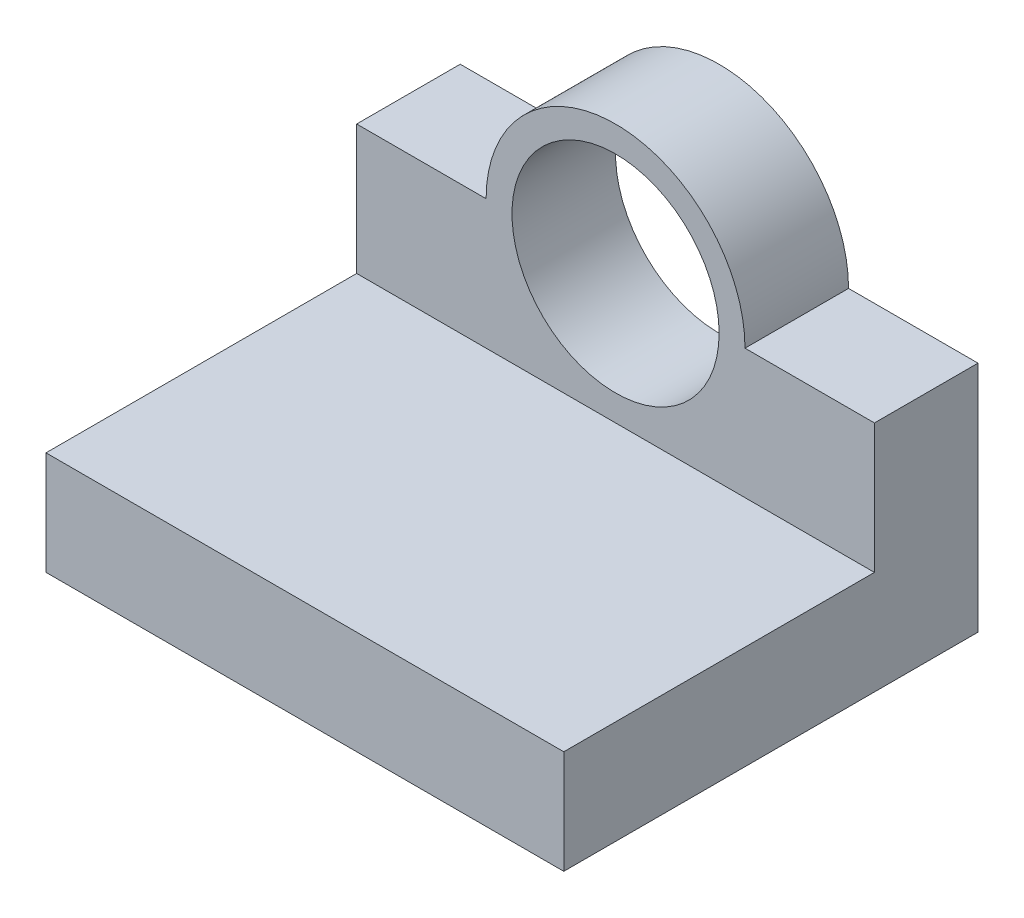
ISO-10303-21;
HEADER;
FILE_DESCRIPTION(('STEP AP214'),'2;1');
FILE_NAME('part.step','',(''),(''),'','','');
FILE_SCHEMA(('AUTOMOTIVE_DESIGN { 1 0 10303 214 1 1 1 1 }'));
ENDSEC;
DATA;
#1=APPLICATION_CONTEXT('core data for automotive mechanical design processes');
#2=APPLICATION_PROTOCOL_DEFINITION('international standard','automotive_design',2000,#1);
#3=PRODUCT_CONTEXT('',#1,'mechanical');
#4=PRODUCT('Part','Part','',(#3));
#5=PRODUCT_RELATED_PRODUCT_CATEGORY('part','',(#4));
#6=PRODUCT_DEFINITION_FORMATION('','',#4);
#7=PRODUCT_DEFINITION_CONTEXT('part definition',#1,'design');
#8=PRODUCT_DEFINITION('design','',#6,#7);
#9=PRODUCT_DEFINITION_SHAPE('','',#8);
#10=(LENGTH_UNIT() NAMED_UNIT(*) SI_UNIT(.MILLI.,.METRE.));
#11=(NAMED_UNIT(*) PLANE_ANGLE_UNIT() SI_UNIT($,.RADIAN.));
#12=(NAMED_UNIT(*) SI_UNIT($,.STERADIAN.) SOLID_ANGLE_UNIT());
#13=UNCERTAINTY_MEASURE_WITH_UNIT(LENGTH_MEASURE(1.E-05),#10,'distance_accuracy_value','');
#14=(GEOMETRIC_REPRESENTATION_CONTEXT(3) GLOBAL_UNCERTAINTY_ASSIGNED_CONTEXT((#13)) GLOBAL_UNIT_ASSIGNED_CONTEXT((#10,
#11,#12)) REPRESENTATION_CONTEXT('',''));
#15=CARTESIAN_POINT('',(0.,0.,0.));
#16=DIRECTION('',(0.,0.,1.));
#17=DIRECTION('',(1.,0.,0.));
#18=AXIS2_PLACEMENT_3D('',#15,#16,#17);
#19=CARTESIAN_POINT('',(0.,22.5,20.));
#20=DIRECTION('',(0.,0.,1.));
#21=DIRECTION('',(1.,0.,0.));
#22=AXIS2_PLACEMENT_3D('',#19,#20,#21);
#23=PLANE('',#22);
#24=DIRECTION('',(-1.,0.,0.));
#25=VECTOR('',#24,1.);
#26=CARTESIAN_POINT('',(-50.,-2.5,20.));
#27=LINE('',#26,#25);
#28=CARTESIAN_POINT('',(50.,-2.49999999999999,20.));
#29=VERTEX_POINT('',#28);
#30=CARTESIAN_POINT('',(-50.,-2.5,20.));
#31=VERTEX_POINT('',#30);
#32=EDGE_CURVE('E54',#29,#31,#27,.T.);
#33=ORIENTED_EDGE('',*,*,#32,.F.);
#34=DIRECTION('',(0.,1.,0.));
#35=VECTOR('',#34,1.);
#36=CARTESIAN_POINT('',(50.,22.5,20.));
#37=LINE('',#36,#35);
#38=CARTESIAN_POINT('',(50.,22.5,20.));
#39=VERTEX_POINT('',#38);
#40=EDGE_CURVE('E93',#29,#39,#37,.T.);
#41=ORIENTED_EDGE('',*,*,#40,.T.);
#42=DIRECTION('',(-1.,0.,0.));
#43=VECTOR('',#42,1.);
#44=CARTESIAN_POINT('',(25.,22.5,20.));
#45=LINE('',#44,#43);
#46=CARTESIAN_POINT('',(25.,22.5,20.));
#47=VERTEX_POINT('',#46);
#48=EDGE_CURVE('E144',#39,#47,#45,.T.);
#49=ORIENTED_EDGE('',*,*,#48,.T.);
#50=CARTESIAN_POINT('',(0.,22.5,20.));
#51=DIRECTION('',(0.,0.,1.));
#52=DIRECTION('',(1.,0.,0.));
#53=AXIS2_PLACEMENT_3D('',#50,#51,#52);
#54=CIRCLE('',#53,25.);
#55=CARTESIAN_POINT('',(-25.,22.5,20.));
#56=VERTEX_POINT('',#55);
#57=EDGE_CURVE('E146',#47,#56,#54,.T.);
#58=ORIENTED_EDGE('',*,*,#57,.T.);
#59=DIRECTION('',(-1.,0.,0.));
#60=VECTOR('',#59,1.);
#61=CARTESIAN_POINT('',(-50.,22.5,20.));
#62=LINE('',#61,#60);
#63=CARTESIAN_POINT('',(-50.,22.5,20.));
#64=VERTEX_POINT('',#63);
#65=EDGE_CURVE('E61',#56,#64,#62,.T.);
#66=ORIENTED_EDGE('',*,*,#65,.T.);
#67=DIRECTION('',(0.,-1.,0.));
#68=VECTOR('',#67,1.);
#69=CARTESIAN_POINT('',(-50.,22.5,20.));
#70=LINE('',#69,#68);
#71=EDGE_CURVE('E149',#64,#31,#70,.T.);
#72=ORIENTED_EDGE('',*,*,#71,.T.);
#73=EDGE_LOOP('',(#33,#41,#49,#58,#66,#72));
#74=FACE_BOUND('',#73,.T.);
#75=CARTESIAN_POINT('',(0.,22.5,20.));
#76=DIRECTION('',(0.,0.,1.));
#77=DIRECTION('',(1.,0.,0.));
#78=AXIS2_PLACEMENT_3D('',#75,#76,#77);
#79=CIRCLE('',#78,20.);
#80=CARTESIAN_POINT('',(20.,22.5,20.));
#81=VERTEX_POINT('',#80);
#82=EDGE_CURVE('E135',#81,#81,#79,.T.);
#83=ORIENTED_EDGE('',*,*,#82,.F.);
#84=EDGE_LOOP('',(#83));
#85=FACE_BOUND('',#84,.T.);
#86=ADVANCED_FACE('F39',(#74,#85),#23,.T.);
#87=CARTESIAN_POINT('',(0.,22.5,0.));
#88=DIRECTION('',(0.,0.,1.));
#89=DIRECTION('',(1.,0.,0.));
#90=AXIS2_PLACEMENT_3D('',#87,#88,#89);
#91=PLANE('',#90);
#92=DIRECTION('',(0.,1.,0.));
#93=VECTOR('',#92,1.);
#94=CARTESIAN_POINT('',(50.,22.5,0.));
#95=LINE('',#94,#93);
#96=CARTESIAN_POINT('',(50.,-22.5,0.));
#97=VERTEX_POINT('',#96);
#98=CARTESIAN_POINT('',(50.,22.5,0.));
#99=VERTEX_POINT('',#98);
#100=EDGE_CURVE('E141',#97,#99,#95,.T.);
#101=ORIENTED_EDGE('',*,*,#100,.F.);
#102=DIRECTION('',(1.,0.,0.));
#103=VECTOR('',#102,1.);
#104=CARTESIAN_POINT('',(-50.,-22.5,0.));
#105=LINE('',#104,#103);
#106=CARTESIAN_POINT('',(-50.,-22.5,0.));
#107=VERTEX_POINT('',#106);
#108=EDGE_CURVE('E89',#107,#97,#105,.T.);
#109=ORIENTED_EDGE('',*,*,#108,.F.);
#110=DIRECTION('',(0.,-1.,0.));
#111=VECTOR('',#110,1.);
#112=CARTESIAN_POINT('',(-50.,22.5,0.));
#113=LINE('',#112,#111);
#114=CARTESIAN_POINT('',(-50.,22.5,0.));
#115=VERTEX_POINT('',#114);
#116=EDGE_CURVE('E159',#115,#107,#113,.T.);
#117=ORIENTED_EDGE('',*,*,#116,.F.);
#118=DIRECTION('',(-1.,0.,0.));
#119=VECTOR('',#118,1.);
#120=CARTESIAN_POINT('',(-50.,22.5,0.));
#121=LINE('',#120,#119);
#122=CARTESIAN_POINT('',(-25.,22.5,0.));
#123=VERTEX_POINT('',#122);
#124=EDGE_CURVE('E157',#123,#115,#121,.T.);
#125=ORIENTED_EDGE('',*,*,#124,.F.);
#126=CARTESIAN_POINT('',(0.,22.5,0.));
#127=DIRECTION('',(0.,0.,1.));
#128=DIRECTION('',(1.,0.,0.));
#129=AXIS2_PLACEMENT_3D('',#126,#127,#128);
#130=CIRCLE('',#129,25.);
#131=CARTESIAN_POINT('',(25.,22.5,0.));
#132=VERTEX_POINT('',#131);
#133=EDGE_CURVE('E155',#132,#123,#130,.T.);
#134=ORIENTED_EDGE('',*,*,#133,.F.);
#135=DIRECTION('',(-1.,0.,0.));
#136=VECTOR('',#135,1.);
#137=CARTESIAN_POINT('',(25.,22.5,0.));
#138=LINE('',#137,#136);
#139=EDGE_CURVE('E153',#99,#132,#138,.T.);
#140=ORIENTED_EDGE('',*,*,#139,.F.);
#141=EDGE_LOOP('',(#101,#109,#117,#125,#134,#140));
#142=FACE_BOUND('',#141,.T.);
#143=CARTESIAN_POINT('',(0.,22.5,0.));
#144=DIRECTION('',(0.,0.,1.));
#145=DIRECTION('',(1.,0.,0.));
#146=AXIS2_PLACEMENT_3D('',#143,#144,#145);
#147=CIRCLE('',#146,20.);
#148=CARTESIAN_POINT('',(20.,22.5,0.));
#149=VERTEX_POINT('',#148);
#150=EDGE_CURVE('E132',#149,#149,#147,.T.);
#151=ORIENTED_EDGE('',*,*,#150,.T.);
#152=EDGE_LOOP('',(#151));
#153=FACE_BOUND('',#152,.T.);
#154=ADVANCED_FACE('F181',(#142,#153),#91,.F.);
#155=CARTESIAN_POINT('',(50.,22.5,20.));
#156=DIRECTION('',(-1.,0.,0.));
#157=DIRECTION('',(0.,0.,1.));
#158=AXIS2_PLACEMENT_3D('',#155,#156,#157);
#159=PLANE('',#158);
#160=ORIENTED_EDGE('',*,*,#100,.T.);
#161=DIRECTION('',(0.,0.,-1.));
#162=VECTOR('',#161,1.);
#163=CARTESIAN_POINT('',(50.,22.5,20.));
#164=LINE('',#163,#162);
#165=EDGE_CURVE('E11',#39,#99,#164,.T.);
#166=ORIENTED_EDGE('',*,*,#165,.F.);
#167=ORIENTED_EDGE('',*,*,#40,.F.);
#168=DIRECTION('',(0.,0.,-1.));
#169=VECTOR('',#168,1.);
#170=CARTESIAN_POINT('',(50.,-2.5,80.));
#171=LINE('',#170,#169);
#172=CARTESIAN_POINT('',(50.,-2.5,80.));
#173=VERTEX_POINT('',#172);
#174=EDGE_CURVE('E114',#173,#29,#171,.T.);
#175=ORIENTED_EDGE('',*,*,#174,.F.);
#176=DIRECTION('',(0.,1.,0.));
#177=VECTOR('',#176,1.);
#178=CARTESIAN_POINT('',(50.,-2.5,80.));
#179=LINE('',#178,#177);
#180=CARTESIAN_POINT('',(50.,-22.5,80.));
#181=VERTEX_POINT('',#180);
#182=EDGE_CURVE('E121',#181,#173,#179,.T.);
#183=ORIENTED_EDGE('',*,*,#182,.F.);
#184=DIRECTION('',(0.,0.,-1.));
#185=VECTOR('',#184,1.);
#186=CARTESIAN_POINT('',(50.,-22.5,20.));
#187=LINE('',#186,#185);
#188=EDGE_CURVE('E151',#181,#97,#187,.T.);
#189=ORIENTED_EDGE('',*,*,#188,.T.);
#190=EDGE_LOOP('',(#160,#166,#167,#175,#183,#189));
#191=FACE_BOUND('',#190,.T.);
#192=ADVANCED_FACE('F41',(#191),#159,.F.);
#193=CARTESIAN_POINT('',(25.,22.5,20.));
#194=DIRECTION('',(0.,-1.,0.));
#195=DIRECTION('',(0.,0.,-1.));
#196=AXIS2_PLACEMENT_3D('',#193,#194,#195);
#197=PLANE('',#196);
#198=ORIENTED_EDGE('',*,*,#139,.T.);
#199=DIRECTION('',(0.,0.,-1.));
#200=VECTOR('',#199,1.);
#201=CARTESIAN_POINT('',(25.,22.5,20.));
#202=LINE('',#201,#200);
#203=EDGE_CURVE('E47',#47,#132,#202,.T.);
#204=ORIENTED_EDGE('',*,*,#203,.F.);
#205=ORIENTED_EDGE('',*,*,#48,.F.);
#206=ORIENTED_EDGE('',*,*,#165,.T.);
#207=EDGE_LOOP('',(#198,#204,#205,#206));
#208=FACE_BOUND('',#207,.T.);
#209=ADVANCED_FACE('F193',(#208),#197,.F.);
#210=CARTESIAN_POINT('',(0.,22.5,20.));
#211=DIRECTION('',(0.,0.,-1.));
#212=DIRECTION('',(-1.,0.,0.));
#213=AXIS2_PLACEMENT_3D('',#210,#211,#212);
#214=CYLINDRICAL_SURFACE('',#213,25.);
#215=ORIENTED_EDGE('',*,*,#133,.T.);
#216=DIRECTION('',(0.,0.,-1.));
#217=VECTOR('',#216,1.);
#218=CARTESIAN_POINT('',(-25.,22.5,20.));
#219=LINE('',#218,#217);
#220=EDGE_CURVE('E168',#56,#123,#219,.T.);
#221=ORIENTED_EDGE('',*,*,#220,.F.);
#222=ORIENTED_EDGE('',*,*,#57,.F.);
#223=ORIENTED_EDGE('',*,*,#203,.T.);
#224=EDGE_LOOP('',(#215,#221,#222,#223));
#225=FACE_BOUND('',#224,.T.);
#226=ADVANCED_FACE('F175',(#225),#214,.T.);
#227=CARTESIAN_POINT('',(-50.,22.5,20.));
#228=DIRECTION('',(0.,-1.,0.));
#229=DIRECTION('',(0.,0.,-1.));
#230=AXIS2_PLACEMENT_3D('',#227,#228,#229);
#231=PLANE('',#230);
#232=ORIENTED_EDGE('',*,*,#124,.T.);
#233=DIRECTION('',(0.,0.,-1.));
#234=VECTOR('',#233,1.);
#235=CARTESIAN_POINT('',(-50.,22.5,20.));
#236=LINE('',#235,#234);
#237=EDGE_CURVE('E165',#64,#115,#236,.T.);
#238=ORIENTED_EDGE('',*,*,#237,.F.);
#239=ORIENTED_EDGE('',*,*,#65,.F.);
#240=ORIENTED_EDGE('',*,*,#220,.T.);
#241=EDGE_LOOP('',(#232,#238,#239,#240));
#242=FACE_BOUND('',#241,.T.);
#243=ADVANCED_FACE('F185',(#242),#231,.F.);
#244=CARTESIAN_POINT('',(-50.,22.5,20.));
#245=DIRECTION('',(1.,0.,0.));
#246=DIRECTION('',(0.,0.,-1.));
#247=AXIS2_PLACEMENT_3D('',#244,#245,#246);
#248=PLANE('',#247);
#249=ORIENTED_EDGE('',*,*,#116,.T.);
#250=DIRECTION('',(0.,0.,-1.));
#251=VECTOR('',#250,1.);
#252=CARTESIAN_POINT('',(-50.,-22.5,20.));
#253=LINE('',#252,#251);
#254=CARTESIAN_POINT('',(-50.,-22.5,80.));
#255=VERTEX_POINT('',#254);
#256=EDGE_CURVE('E163',#255,#107,#253,.T.);
#257=ORIENTED_EDGE('',*,*,#256,.F.);
#258=DIRECTION('',(0.,-1.,0.));
#259=VECTOR('',#258,1.);
#260=CARTESIAN_POINT('',(-50.,-2.5,80.));
#261=LINE('',#260,#259);
#262=CARTESIAN_POINT('',(-50.,-2.5,80.));
#263=VERTEX_POINT('',#262);
#264=EDGE_CURVE('E120',#263,#255,#261,.T.);
#265=ORIENTED_EDGE('',*,*,#264,.F.);
#266=DIRECTION('',(0.,0.,-1.));
#267=VECTOR('',#266,1.);
#268=CARTESIAN_POINT('',(-50.,-2.5,80.));
#269=LINE('',#268,#267);
#270=EDGE_CURVE('E116',#263,#31,#269,.T.);
#271=ORIENTED_EDGE('',*,*,#270,.T.);
#272=ORIENTED_EDGE('',*,*,#71,.F.);
#273=ORIENTED_EDGE('',*,*,#237,.T.);
#274=EDGE_LOOP('',(#249,#257,#265,#271,#272,#273));
#275=FACE_BOUND('',#274,.T.);
#276=ADVANCED_FACE('F188',(#275),#248,.F.);
#277=CARTESIAN_POINT('',(-50.,-22.5,20.));
#278=DIRECTION('',(0.,1.,0.));
#279=DIRECTION('',(0.,0.,1.));
#280=AXIS2_PLACEMENT_3D('',#277,#278,#279);
#281=PLANE('',#280);
#282=ORIENTED_EDGE('',*,*,#108,.T.);
#283=ORIENTED_EDGE('',*,*,#188,.F.);
#284=DIRECTION('',(1.,0.,0.));
#285=VECTOR('',#284,1.);
#286=CARTESIAN_POINT('',(-50.,-22.5,80.));
#287=LINE('',#286,#285);
#288=EDGE_CURVE('E127',#255,#181,#287,.T.);
#289=ORIENTED_EDGE('',*,*,#288,.F.);
#290=ORIENTED_EDGE('',*,*,#256,.T.);
#291=EDGE_LOOP('',(#282,#283,#289,#290));
#292=FACE_BOUND('',#291,.T.);
#293=ADVANCED_FACE('F192',(#292),#281,.F.);
#294=CARTESIAN_POINT('',(0.,22.5,20.));
#295=DIRECTION('',(0.,0.,-1.));
#296=DIRECTION('',(-1.,0.,0.));
#297=AXIS2_PLACEMENT_3D('',#294,#295,#296);
#298=CYLINDRICAL_SURFACE('',#297,20.);
#299=ORIENTED_EDGE('',*,*,#82,.T.);
#300=EDGE_LOOP('',(#299));
#301=FACE_BOUND('',#300,.T.);
#302=ORIENTED_EDGE('',*,*,#150,.F.);
#303=EDGE_LOOP('',(#302));
#304=FACE_BOUND('',#303,.T.);
#305=ADVANCED_FACE('F208',(#301,#304),#298,.F.);
#306=CARTESIAN_POINT('',(-50.,-2.5,80.));
#307=DIRECTION('',(0.,-1.,0.));
#308=DIRECTION('',(0.,0.,-1.));
#309=AXIS2_PLACEMENT_3D('',#306,#307,#308);
#310=PLANE('',#309);
#311=ORIENTED_EDGE('',*,*,#32,.T.);
#312=ORIENTED_EDGE('',*,*,#270,.F.);
#313=DIRECTION('',(-1.,0.,0.));
#314=VECTOR('',#313,1.);
#315=CARTESIAN_POINT('',(-50.,-2.5,80.));
#316=LINE('',#315,#314);
#317=EDGE_CURVE('E110',#173,#263,#316,.T.);
#318=ORIENTED_EDGE('',*,*,#317,.F.);
#319=ORIENTED_EDGE('',*,*,#174,.T.);
#320=EDGE_LOOP('',(#311,#312,#318,#319));
#321=FACE_BOUND('',#320,.T.);
#322=ADVANCED_FACE('F112',(#321),#310,.F.);
#323=CARTESIAN_POINT('',(0.,0.,80.));
#324=DIRECTION('',(0.,0.,1.));
#325=DIRECTION('',(1.,0.,0.));
#326=AXIS2_PLACEMENT_3D('',#323,#324,#325);
#327=PLANE('',#326);
#328=ORIENTED_EDGE('',*,*,#182,.T.);
#329=ORIENTED_EDGE('',*,*,#317,.T.);
#330=ORIENTED_EDGE('',*,*,#264,.T.);
#331=ORIENTED_EDGE('',*,*,#288,.T.);
#332=EDGE_LOOP('',(#328,#329,#330,#331));
#333=FACE_BOUND('',#332,.T.);
#334=ADVANCED_FACE('F125',(#333),#327,.T.);
#335=CLOSED_SHELL('',(#86,#154,#192,#209,#226,#243,#276,#293,#305,#322,#334));
#336=MANIFOLD_SOLID_BREP('B2',#335);
#337=ADVANCED_BREP_SHAPE_REPRESENTATION('',(#18,#336),#14);
#338=SHAPE_DEFINITION_REPRESENTATION(#9,#337);
ENDSEC;
END-ISO-10303-21;
